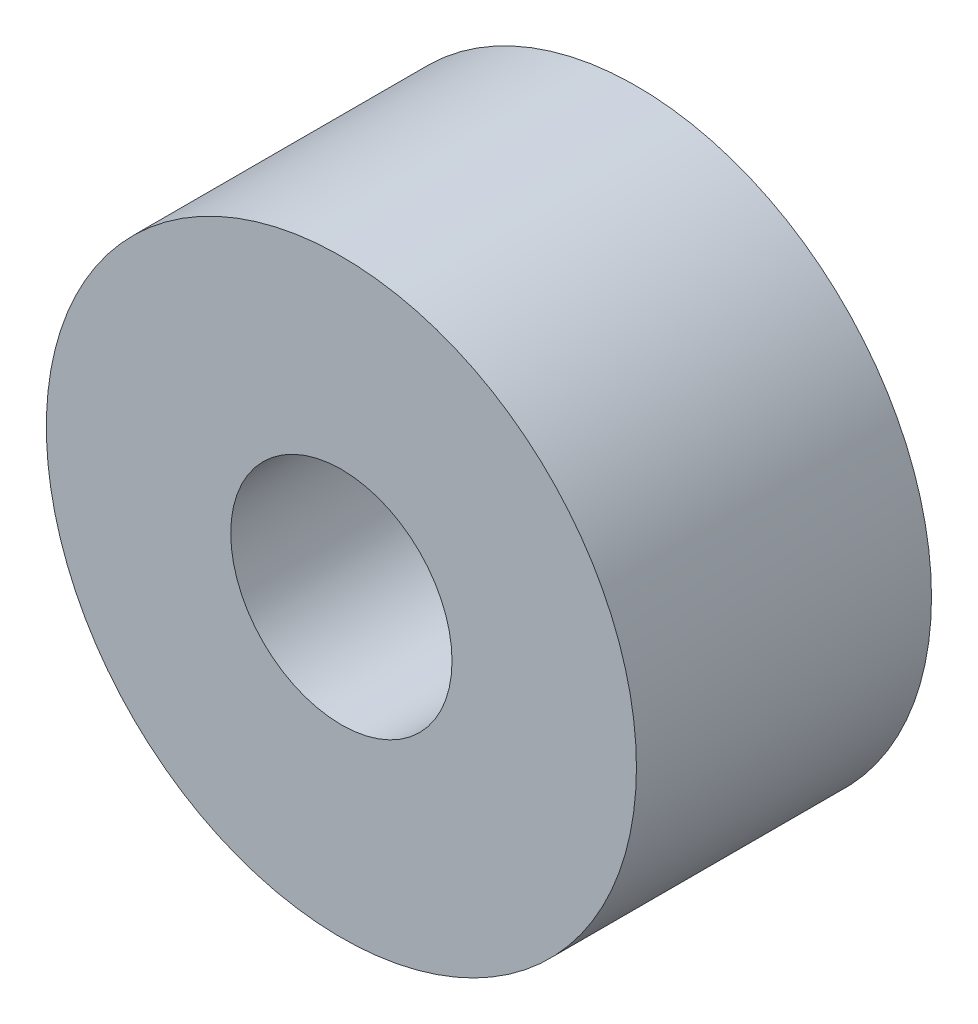
ISO-10303-21;
HEADER;
FILE_DESCRIPTION(('STEP AP214'),'2;1');
FILE_NAME('part.step','',(''),(''),'','','');
FILE_SCHEMA(('AUTOMOTIVE_DESIGN { 1 0 10303 214 1 1 1 1 }'));
ENDSEC;
DATA;
#1=APPLICATION_CONTEXT('core data for automotive mechanical design processes');
#2=APPLICATION_PROTOCOL_DEFINITION('international standard','automotive_design',2000,#1);
#3=PRODUCT_CONTEXT('',#1,'mechanical');
#4=PRODUCT('Part','Part','',(#3));
#5=PRODUCT_RELATED_PRODUCT_CATEGORY('part','',(#4));
#6=PRODUCT_DEFINITION_FORMATION('','',#4);
#7=PRODUCT_DEFINITION_CONTEXT('part definition',#1,'design');
#8=PRODUCT_DEFINITION('design','',#6,#7);
#9=PRODUCT_DEFINITION_SHAPE('','',#8);
#10=(LENGTH_UNIT() NAMED_UNIT(*) SI_UNIT(.MILLI.,.METRE.));
#11=(NAMED_UNIT(*) PLANE_ANGLE_UNIT() SI_UNIT($,.RADIAN.));
#12=(NAMED_UNIT(*) SI_UNIT($,.STERADIAN.) SOLID_ANGLE_UNIT());
#13=UNCERTAINTY_MEASURE_WITH_UNIT(LENGTH_MEASURE(1.E-05),#10,'distance_accuracy_value','');
#14=(GEOMETRIC_REPRESENTATION_CONTEXT(3) GLOBAL_UNCERTAINTY_ASSIGNED_CONTEXT((#13)) GLOBAL_UNIT_ASSIGNED_CONTEXT((#10,
#11,#12)) REPRESENTATION_CONTEXT('',''));
#15=CARTESIAN_POINT('',(0.,0.,0.));
#16=DIRECTION('',(0.,0.,1.));
#17=DIRECTION('',(1.,0.,0.));
#18=AXIS2_PLACEMENT_3D('',#15,#16,#17);
#19=CARTESIAN_POINT('',(0.,0.,6.35));
#20=DIRECTION('',(0.,0.,1.));
#21=DIRECTION('',(1.,0.,0.));
#22=AXIS2_PLACEMENT_3D('',#19,#20,#21);
#23=PLANE('',#22);
#24=CARTESIAN_POINT('',(0.,0.,6.35));
#25=DIRECTION('',(0.,0.,1.));
#26=DIRECTION('',(1.,0.,0.));
#27=AXIS2_PLACEMENT_3D('',#24,#25,#26);
#28=CIRCLE('',#27,6.35);
#29=CARTESIAN_POINT('',(6.35,0.,6.35));
#30=VERTEX_POINT('',#29);
#31=EDGE_CURVE('E10',#30,#30,#28,.T.);
#32=ORIENTED_EDGE('',*,*,#31,.T.);
#33=EDGE_LOOP('',(#32));
#34=FACE_BOUND('',#33,.T.);
#35=CARTESIAN_POINT('',(0.,0.,6.35));
#36=DIRECTION('',(0.,0.,1.));
#37=DIRECTION('',(1.,0.,0.));
#38=AXIS2_PLACEMENT_3D('',#35,#36,#37);
#39=CIRCLE('',#38,2.38125);
#40=CARTESIAN_POINT('',(2.38125,0.,6.35));
#41=VERTEX_POINT('',#40);
#42=EDGE_CURVE('E50',#41,#41,#39,.T.);
#43=ORIENTED_EDGE('',*,*,#42,.F.);
#44=EDGE_LOOP('',(#43));
#45=FACE_BOUND('',#44,.T.);
#46=ADVANCED_FACE('F37',(#34,#45),#23,.T.);
#47=CARTESIAN_POINT('',(0.,0.,0.));
#48=DIRECTION('',(0.,0.,1.));
#49=DIRECTION('',(1.,0.,0.));
#50=AXIS2_PLACEMENT_3D('',#47,#48,#49);
#51=PLANE('',#50);
#52=CARTESIAN_POINT('',(0.,0.,0.));
#53=DIRECTION('',(0.,0.,1.));
#54=DIRECTION('',(1.,0.,0.));
#55=AXIS2_PLACEMENT_3D('',#52,#53,#54);
#56=CIRCLE('',#55,6.35);
#57=CARTESIAN_POINT('',(6.35,0.,0.));
#58=VERTEX_POINT('',#57);
#59=EDGE_CURVE('E41',#58,#58,#56,.T.);
#60=ORIENTED_EDGE('',*,*,#59,.F.);
#61=EDGE_LOOP('',(#60));
#62=FACE_BOUND('',#61,.T.);
#63=CARTESIAN_POINT('',(0.,0.,0.));
#64=DIRECTION('',(0.,0.,1.));
#65=DIRECTION('',(1.,0.,0.));
#66=AXIS2_PLACEMENT_3D('',#63,#64,#65);
#67=CIRCLE('',#66,2.38125);
#68=CARTESIAN_POINT('',(2.38125,0.,0.));
#69=VERTEX_POINT('',#68);
#70=EDGE_CURVE('E52',#69,#69,#67,.T.);
#71=ORIENTED_EDGE('',*,*,#70,.T.);
#72=EDGE_LOOP('',(#71));
#73=FACE_BOUND('',#72,.T.);
#74=ADVANCED_FACE('F64',(#62,#73),#51,.F.);
#75=CARTESIAN_POINT('',(0.,0.,6.35));
#76=DIRECTION('',(0.,0.,-1.));
#77=DIRECTION('',(-1.,0.,0.));
#78=AXIS2_PLACEMENT_3D('',#75,#76,#77);
#79=CYLINDRICAL_SURFACE('',#78,6.35);
#80=ORIENTED_EDGE('',*,*,#31,.F.);
#81=EDGE_LOOP('',(#80));
#82=FACE_BOUND('',#81,.T.);
#83=ORIENTED_EDGE('',*,*,#59,.T.);
#84=EDGE_LOOP('',(#83));
#85=FACE_BOUND('',#84,.T.);
#86=ADVANCED_FACE('F39',(#82,#85),#79,.T.);
#87=CARTESIAN_POINT('',(0.,0.,6.35));
#88=DIRECTION('',(0.,0.,-1.));
#89=DIRECTION('',(-1.,0.,0.));
#90=AXIS2_PLACEMENT_3D('',#87,#88,#89);
#91=CYLINDRICAL_SURFACE('',#90,2.38125);
#92=ORIENTED_EDGE('',*,*,#42,.T.);
#93=EDGE_LOOP('',(#92));
#94=FACE_BOUND('',#93,.T.);
#95=ORIENTED_EDGE('',*,*,#70,.F.);
#96=EDGE_LOOP('',(#95));
#97=FACE_BOUND('',#96,.T.);
#98=ADVANCED_FACE('F60',(#94,#97),#91,.F.);
#99=CLOSED_SHELL('',(#46,#74,#86,#98));
#100=MANIFOLD_SOLID_BREP('B2',#99);
#101=ADVANCED_BREP_SHAPE_REPRESENTATION('',(#18,#100),#14);
#102=SHAPE_DEFINITION_REPRESENTATION(#9,#101);
ENDSEC;
END-ISO-10303-21;
